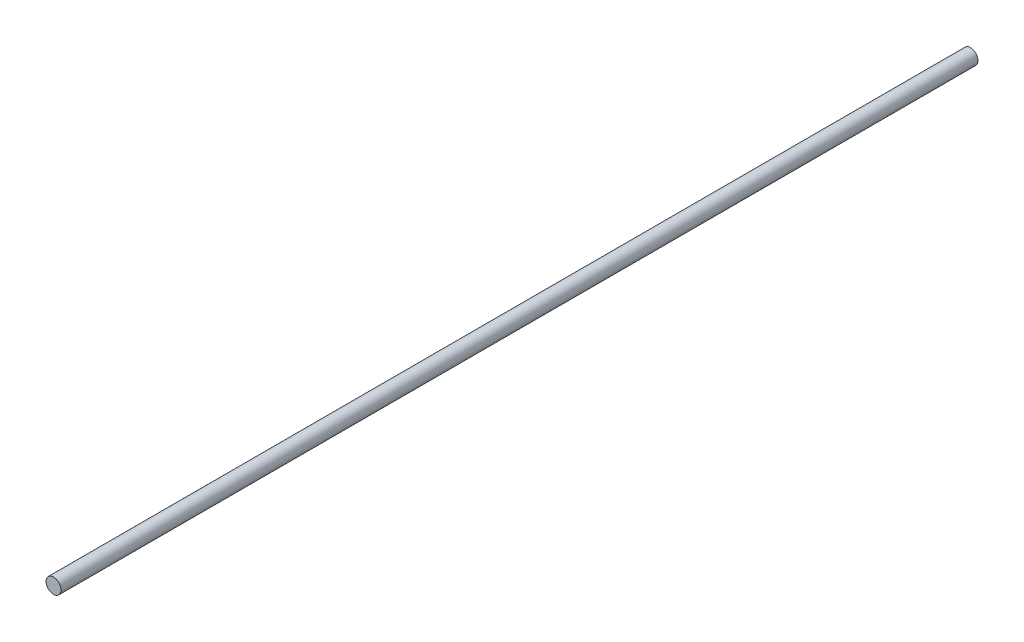
ISO-10303-21;
HEADER;
FILE_DESCRIPTION(('STEP AP214'),'2;1');
FILE_NAME('part.step','',(''),(''),'','','');
FILE_SCHEMA(('AUTOMOTIVE_DESIGN { 1 0 10303 214 1 1 1 1 }'));
ENDSEC;
DATA;
#1=APPLICATION_CONTEXT('core data for automotive mechanical design processes');
#2=APPLICATION_PROTOCOL_DEFINITION('international standard','automotive_design',2000,#1);
#3=PRODUCT_CONTEXT('',#1,'mechanical');
#4=PRODUCT('Part','Part','',(#3));
#5=PRODUCT_RELATED_PRODUCT_CATEGORY('part','',(#4));
#6=PRODUCT_DEFINITION_FORMATION('','',#4);
#7=PRODUCT_DEFINITION_CONTEXT('part definition',#1,'design');
#8=PRODUCT_DEFINITION('design','',#6,#7);
#9=PRODUCT_DEFINITION_SHAPE('','',#8);
#10=(LENGTH_UNIT() NAMED_UNIT(*) SI_UNIT(.MILLI.,.METRE.));
#11=(NAMED_UNIT(*) PLANE_ANGLE_UNIT() SI_UNIT($,.RADIAN.));
#12=(NAMED_UNIT(*) SI_UNIT($,.STERADIAN.) SOLID_ANGLE_UNIT());
#13=UNCERTAINTY_MEASURE_WITH_UNIT(LENGTH_MEASURE(1.E-05),#10,'distance_accuracy_value','');
#14=(GEOMETRIC_REPRESENTATION_CONTEXT(3) GLOBAL_UNCERTAINTY_ASSIGNED_CONTEXT((#13)) GLOBAL_UNIT_ASSIGNED_CONTEXT((#10,
#11,#12)) REPRESENTATION_CONTEXT('',''));
#15=CARTESIAN_POINT('',(0.,0.,0.));
#16=DIRECTION('',(0.,0.,1.));
#17=DIRECTION('',(1.,0.,0.));
#18=AXIS2_PLACEMENT_3D('',#15,#16,#17);
#19=CARTESIAN_POINT('',(0.,0.,736.6));
#20=DIRECTION('',(0.,0.,-1.));
#21=DIRECTION('',(-1.,0.,0.));
#22=AXIS2_PLACEMENT_3D('',#19,#20,#21);
#23=CYLINDRICAL_SURFACE('',#22,6.0325);
#24=CARTESIAN_POINT('',(0.,0.,736.6));
#25=DIRECTION('',(0.,0.,1.));
#26=DIRECTION('',(1.,0.,0.));
#27=AXIS2_PLACEMENT_3D('',#24,#25,#26);
#28=CIRCLE('',#27,6.0325);
#29=CARTESIAN_POINT('',(6.0325,0.,736.6));
#30=VERTEX_POINT('',#29);
#31=EDGE_CURVE('E10',#30,#30,#28,.T.);
#32=ORIENTED_EDGE('',*,*,#31,.F.);
#33=EDGE_LOOP('',(#32));
#34=FACE_BOUND('',#33,.T.);
#35=CARTESIAN_POINT('',(0.,0.,0.));
#36=DIRECTION('',(0.,0.,1.));
#37=DIRECTION('',(1.,0.,0.));
#38=AXIS2_PLACEMENT_3D('',#35,#36,#37);
#39=CIRCLE('',#38,6.0325);
#40=CARTESIAN_POINT('',(6.0325,0.,0.));
#41=VERTEX_POINT('',#40);
#42=EDGE_CURVE('E42',#41,#41,#39,.T.);
#43=ORIENTED_EDGE('',*,*,#42,.T.);
#44=EDGE_LOOP('',(#43));
#45=FACE_BOUND('',#44,.T.);
#46=ADVANCED_FACE('F39',(#34,#45),#23,.T.);
#47=CARTESIAN_POINT('',(0.,0.,736.6));
#48=DIRECTION('',(0.,0.,1.));
#49=DIRECTION('',(1.,0.,0.));
#50=AXIS2_PLACEMENT_3D('',#47,#48,#49);
#51=PLANE('',#50);
#52=ORIENTED_EDGE('',*,*,#31,.T.);
#53=EDGE_LOOP('',(#52));
#54=FACE_BOUND('',#53,.T.);
#55=ADVANCED_FACE('F56',(#54),#51,.T.);
#56=CARTESIAN_POINT('',(0.,0.,0.));
#57=DIRECTION('',(0.,0.,1.));
#58=DIRECTION('',(1.,0.,0.));
#59=AXIS2_PLACEMENT_3D('',#56,#57,#58);
#60=PLANE('',#59);
#61=ORIENTED_EDGE('',*,*,#42,.F.);
#62=EDGE_LOOP('',(#61));
#63=FACE_BOUND('',#62,.T.);
#64=ADVANCED_FACE('F54',(#63),#60,.F.);
#65=CLOSED_SHELL('',(#46,#55,#64));
#66=MANIFOLD_SOLID_BREP('B2',#65);
#67=ADVANCED_BREP_SHAPE_REPRESENTATION('',(#18,#66),#14);
#68=SHAPE_DEFINITION_REPRESENTATION(#9,#67);
ENDSEC;
END-ISO-10303-21;
